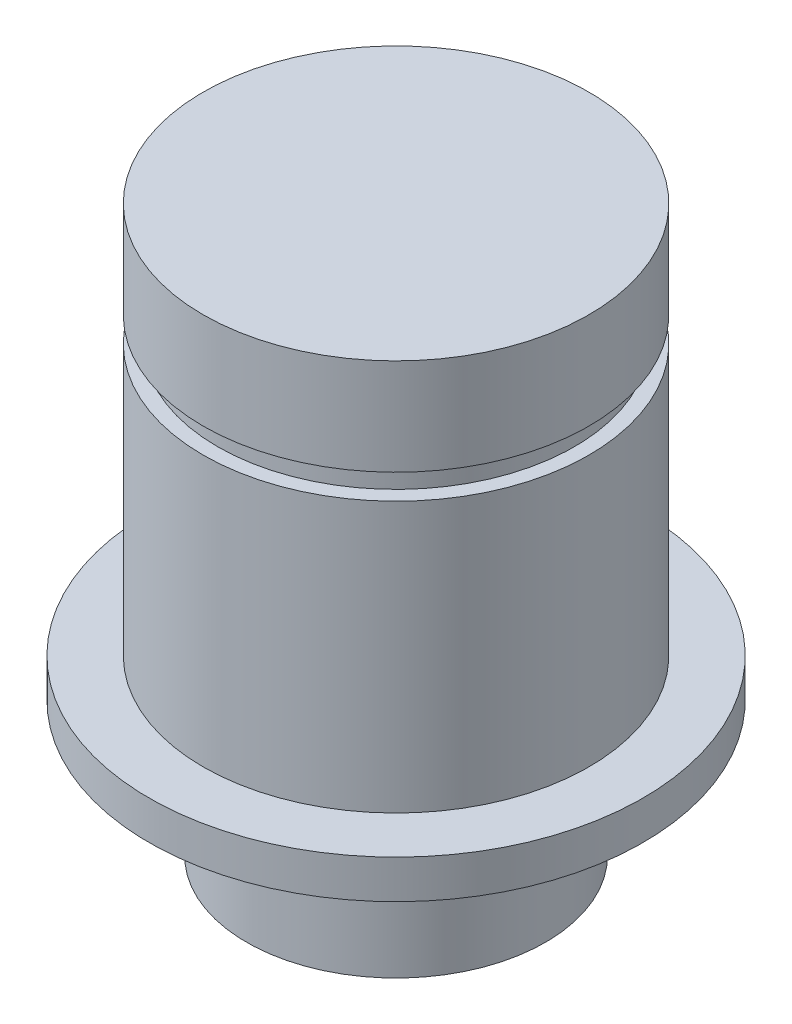
ISO-10303-21;
HEADER;
FILE_DESCRIPTION(('STEP AP214'),'2;1');
FILE_NAME('part.step','',(''),(''),'','','');
FILE_SCHEMA(('AUTOMOTIVE_DESIGN { 1 0 10303 214 1 1 1 1 }'));
ENDSEC;
DATA;
#1=APPLICATION_CONTEXT('core data for automotive mechanical design processes');
#2=APPLICATION_PROTOCOL_DEFINITION('international standard','automotive_design',2000,#1);
#3=PRODUCT_CONTEXT('',#1,'mechanical');
#4=PRODUCT('Part','Part','',(#3));
#5=PRODUCT_RELATED_PRODUCT_CATEGORY('part','',(#4));
#6=PRODUCT_DEFINITION_FORMATION('','',#4);
#7=PRODUCT_DEFINITION_CONTEXT('part definition',#1,'design');
#8=PRODUCT_DEFINITION('design','',#6,#7);
#9=PRODUCT_DEFINITION_SHAPE('','',#8);
#10=(LENGTH_UNIT() NAMED_UNIT(*) SI_UNIT(.MILLI.,.METRE.));
#11=(NAMED_UNIT(*) PLANE_ANGLE_UNIT() SI_UNIT($,.RADIAN.));
#12=(NAMED_UNIT(*) SI_UNIT($,.STERADIAN.) SOLID_ANGLE_UNIT());
#13=UNCERTAINTY_MEASURE_WITH_UNIT(LENGTH_MEASURE(1.E-05),#10,'distance_accuracy_value','');
#14=(GEOMETRIC_REPRESENTATION_CONTEXT(3) GLOBAL_UNCERTAINTY_ASSIGNED_CONTEXT((#13)) GLOBAL_UNIT_ASSIGNED_CONTEXT((#10,
#11,#12)) REPRESENTATION_CONTEXT('',''));
#15=CARTESIAN_POINT('',(0.,0.,0.));
#16=DIRECTION('',(0.,0.,1.));
#17=DIRECTION('',(1.,0.,0.));
#18=AXIS2_PLACEMENT_3D('',#15,#16,#17);
#19=CARTESIAN_POINT('',(0.,-48.5842712474619,0.));
#20=DIRECTION('',(0.,1.,0.));
#21=DIRECTION('',(0.,0.,1.));
#22=AXIS2_PLACEMENT_3D('',#19,#20,#21);
#23=CYLINDRICAL_SURFACE('',#22,10.);
#24=CARTESIAN_POINT('',(0.,-20.3,0.));
#25=DIRECTION('',(0.,1.,0.));
#26=DIRECTION('',(0.,0.,1.));
#27=AXIS2_PLACEMENT_3D('',#24,#25,#26);
#28=CIRCLE('',#27,10.);
#29=CARTESIAN_POINT('',(0.,-20.3,10.));
#30=VERTEX_POINT('',#29);
#31=EDGE_CURVE('E10',#30,#30,#28,.F.);
#32=ORIENTED_EDGE('',*,*,#31,.F.);
#33=EDGE_LOOP('',(#32));
#34=FACE_BOUND('',#33,.T.);
#35=CARTESIAN_POINT('',(0.,-6.3,0.));
#36=DIRECTION('',(0.,1.,0.));
#37=DIRECTION('',(0.,0.,1.));
#38=AXIS2_PLACEMENT_3D('',#35,#36,#37);
#39=CIRCLE('',#38,10.);
#40=CARTESIAN_POINT('',(0.,-6.3,10.));
#41=VERTEX_POINT('',#40);
#42=EDGE_CURVE('E39',#41,#41,#39,.T.);
#43=ORIENTED_EDGE('',*,*,#42,.F.);
#44=EDGE_LOOP('',(#43));
#45=FACE_BOUND('',#44,.T.);
#46=ADVANCED_FACE('F33',(#34,#45),#23,.T.);
#47=CARTESIAN_POINT('',(0.,-6.3,0.));
#48=DIRECTION('',(0.,1.,0.));
#49=DIRECTION('',(0.,0.,1.));
#50=AXIS2_PLACEMENT_3D('',#47,#48,#49);
#51=PLANE('',#50);
#52=CARTESIAN_POINT('',(0.,-6.3,0.));
#53=DIRECTION('',(0.,1.,0.));
#54=DIRECTION('',(0.,0.,1.));
#55=AXIS2_PLACEMENT_3D('',#52,#53,#54);
#56=CIRCLE('',#55,9.25);
#57=CARTESIAN_POINT('',(0.,-6.3,9.25));
#58=VERTEX_POINT('',#57);
#59=EDGE_CURVE('E55',#58,#58,#56,.T.);
#60=ORIENTED_EDGE('',*,*,#59,.F.);
#61=EDGE_LOOP('',(#60));
#62=FACE_BOUND('',#61,.T.);
#63=ORIENTED_EDGE('',*,*,#42,.T.);
#64=EDGE_LOOP('',(#63));
#65=FACE_BOUND('',#64,.T.);
#66=ADVANCED_FACE('F84',(#62,#65),#51,.T.);
#67=CARTESIAN_POINT('',(0.,-58.5038671967512,0.));
#68=DIRECTION('',(0.,1.,0.));
#69=DIRECTION('',(0.,0.,1.));
#70=AXIS2_PLACEMENT_3D('',#67,#68,#69);
#71=CYLINDRICAL_SURFACE('',#70,12.8);
#72=CARTESIAN_POINT('',(0.,-20.3,0.));
#73=DIRECTION('',(0.,-1.,0.));
#74=DIRECTION('',(0.,0.,-1.));
#75=AXIS2_PLACEMENT_3D('',#72,#73,#74);
#76=CIRCLE('',#75,12.8);
#77=CARTESIAN_POINT('',(0.,-20.3,-12.8));
#78=VERTEX_POINT('',#77);
#79=EDGE_CURVE('E47',#78,#78,#76,.T.);
#80=ORIENTED_EDGE('',*,*,#79,.T.);
#81=EDGE_LOOP('',(#80));
#82=FACE_BOUND('',#81,.T.);
#83=CARTESIAN_POINT('',(0.,-22.3,0.));
#84=DIRECTION('',(0.,-1.,0.));
#85=DIRECTION('',(0.,0.,-1.));
#86=AXIS2_PLACEMENT_3D('',#83,#84,#85);
#87=CIRCLE('',#86,12.8);
#88=CARTESIAN_POINT('',(0.,-22.3,-12.8));
#89=VERTEX_POINT('',#88);
#90=EDGE_CURVE('E43',#89,#89,#87,.T.);
#91=ORIENTED_EDGE('',*,*,#90,.F.);
#92=EDGE_LOOP('',(#91));
#93=FACE_BOUND('',#92,.T.);
#94=ADVANCED_FACE('F82',(#82,#93),#71,.T.);
#95=CARTESIAN_POINT('',(0.,-20.3,0.));
#96=DIRECTION('',(0.,-1.,0.));
#97=DIRECTION('',(0.,0.,-1.));
#98=AXIS2_PLACEMENT_3D('',#95,#96,#97);
#99=PLANE('',#98);
#100=ORIENTED_EDGE('',*,*,#31,.T.);
#101=EDGE_LOOP('',(#100));
#102=FACE_BOUND('',#101,.T.);
#103=ORIENTED_EDGE('',*,*,#79,.F.);
#104=EDGE_LOOP('',(#103));
#105=FACE_BOUND('',#104,.T.);
#106=ADVANCED_FACE('F78',(#102,#105),#99,.F.);
#107=CARTESIAN_POINT('',(0.,-22.3,0.));
#108=DIRECTION('',(0.,-1.,0.));
#109=DIRECTION('',(0.,0.,-1.));
#110=AXIS2_PLACEMENT_3D('',#107,#108,#109);
#111=PLANE('',#110);
#112=CARTESIAN_POINT('',(0.,-22.3,0.));
#113=DIRECTION('',(0.,-1.,0.));
#114=DIRECTION('',(0.,0.,-1.));
#115=AXIS2_PLACEMENT_3D('',#112,#113,#114);
#116=CIRCLE('',#115,7.75);
#117=CARTESIAN_POINT('',(0.,-22.3,-7.75));
#118=VERTEX_POINT('',#117);
#119=EDGE_CURVE('E67',#118,#118,#116,.T.);
#120=ORIENTED_EDGE('',*,*,#119,.F.);
#121=EDGE_LOOP('',(#120));
#122=FACE_BOUND('',#121,.T.);
#123=ORIENTED_EDGE('',*,*,#90,.T.);
#124=EDGE_LOOP('',(#123));
#125=FACE_BOUND('',#124,.T.);
#126=ADVANCED_FACE('F74',(#122,#125),#111,.T.);
#127=CARTESIAN_POINT('',(0.,21.1629509039023,0.));
#128=DIRECTION('',(0.,-1.,0.));
#129=DIRECTION('',(0.,0.,-1.));
#130=AXIS2_PLACEMENT_3D('',#127,#128,#129);
#131=CYLINDRICAL_SURFACE('',#130,9.25);
#132=ORIENTED_EDGE('',*,*,#59,.T.);
#133=EDGE_LOOP('',(#132));
#134=FACE_BOUND('',#133,.T.);
#135=CARTESIAN_POINT('',(0.,-5.,0.));
#136=DIRECTION('',(0.,1.,0.));
#137=DIRECTION('',(0.,0.,1.));
#138=AXIS2_PLACEMENT_3D('',#135,#136,#137);
#139=CIRCLE('',#138,9.25);
#140=CARTESIAN_POINT('',(0.,-5.,9.25));
#141=VERTEX_POINT('',#140);
#142=EDGE_CURVE('E52',#141,#141,#139,.T.);
#143=ORIENTED_EDGE('',*,*,#142,.F.);
#144=EDGE_LOOP('',(#143));
#145=FACE_BOUND('',#144,.T.);
#146=ADVANCED_FACE('F77',(#134,#145),#131,.T.);
#147=CARTESIAN_POINT('',(0.,28.2842712474619,0.));
#148=DIRECTION('',(0.,-1.,0.));
#149=DIRECTION('',(0.,0.,-1.));
#150=AXIS2_PLACEMENT_3D('',#147,#148,#149);
#151=CYLINDRICAL_SURFACE('',#150,10.);
#152=CARTESIAN_POINT('',(0.,-5.,0.));
#153=DIRECTION('',(0.,1.,0.));
#154=DIRECTION('',(0.,0.,1.));
#155=AXIS2_PLACEMENT_3D('',#152,#153,#154);
#156=CIRCLE('',#155,10.);
#157=CARTESIAN_POINT('',(0.,-5.,10.));
#158=VERTEX_POINT('',#157);
#159=EDGE_CURVE('E61',#158,#158,#156,.T.);
#160=ORIENTED_EDGE('',*,*,#159,.T.);
#161=EDGE_LOOP('',(#160));
#162=FACE_BOUND('',#161,.T.);
#163=CARTESIAN_POINT('',(0.,0.,0.));
#164=DIRECTION('',(0.,1.,0.));
#165=DIRECTION('',(0.,0.,1.));
#166=AXIS2_PLACEMENT_3D('',#163,#164,#165);
#167=CIRCLE('',#166,10.);
#168=CARTESIAN_POINT('',(0.,0.,10.));
#169=VERTEX_POINT('',#168);
#170=EDGE_CURVE('E58',#169,#169,#167,.T.);
#171=ORIENTED_EDGE('',*,*,#170,.F.);
#172=EDGE_LOOP('',(#171));
#173=FACE_BOUND('',#172,.T.);
#174=ADVANCED_FACE('F115',(#162,#173),#151,.T.);
#175=CARTESIAN_POINT('',(0.,-5.,0.));
#176=DIRECTION('',(0.,1.,0.));
#177=DIRECTION('',(0.,0.,1.));
#178=AXIS2_PLACEMENT_3D('',#175,#176,#177);
#179=PLANE('',#178);
#180=ORIENTED_EDGE('',*,*,#142,.T.);
#181=EDGE_LOOP('',(#180));
#182=FACE_BOUND('',#181,.T.);
#183=ORIENTED_EDGE('',*,*,#159,.F.);
#184=EDGE_LOOP('',(#183));
#185=FACE_BOUND('',#184,.T.);
#186=ADVANCED_FACE('F126',(#182,#185),#179,.F.);
#187=CARTESIAN_POINT('',(0.,0.,0.));
#188=DIRECTION('',(0.,1.,0.));
#189=DIRECTION('',(0.,0.,1.));
#190=AXIS2_PLACEMENT_3D('',#187,#188,#189);
#191=PLANE('',#190);
#192=ORIENTED_EDGE('',*,*,#170,.T.);
#193=EDGE_LOOP('',(#192));
#194=FACE_BOUND('',#193,.T.);
#195=ADVANCED_FACE('F136',(#194),#191,.T.);
#196=CARTESIAN_POINT('',(0.,-51.220310216783,0.));
#197=DIRECTION('',(0.,1.,0.));
#198=DIRECTION('',(0.,0.,1.));
#199=AXIS2_PLACEMENT_3D('',#196,#197,#198);
#200=CYLINDRICAL_SURFACE('',#199,7.75);
#201=ORIENTED_EDGE('',*,*,#119,.T.);
#202=EDGE_LOOP('',(#201));
#203=FACE_BOUND('',#202,.T.);
#204=CARTESIAN_POINT('',(0.,-29.3,0.));
#205=DIRECTION('',(0.,-1.,0.));
#206=DIRECTION('',(0.,0.,-1.));
#207=AXIS2_PLACEMENT_3D('',#204,#205,#206);
#208=CIRCLE('',#207,7.75);
#209=CARTESIAN_POINT('',(0.,-29.3,-7.75));
#210=VERTEX_POINT('',#209);
#211=EDGE_CURVE('E64',#210,#210,#208,.T.);
#212=ORIENTED_EDGE('',*,*,#211,.F.);
#213=EDGE_LOOP('',(#212));
#214=FACE_BOUND('',#213,.T.);
#215=ADVANCED_FACE('F71',(#203,#214),#200,.T.);
#216=CARTESIAN_POINT('',(0.,-29.3,0.));
#217=DIRECTION('',(0.,-1.,0.));
#218=DIRECTION('',(0.,0.,-1.));
#219=AXIS2_PLACEMENT_3D('',#216,#217,#218);
#220=PLANE('',#219);
#221=ORIENTED_EDGE('',*,*,#211,.T.);
#222=EDGE_LOOP('',(#221));
#223=FACE_BOUND('',#222,.T.);
#224=ADVANCED_FACE('F160',(#223),#220,.T.);
#225=CLOSED_SHELL('',(#46,#66,#94,#106,#126,#146,#174,#186,#195,#215,#224));
#226=MANIFOLD_SOLID_BREP('B2',#225);
#227=ADVANCED_BREP_SHAPE_REPRESENTATION('',(#18,#226),#14);
#228=SHAPE_DEFINITION_REPRESENTATION(#9,#227);
ENDSEC;
END-ISO-10303-21;
